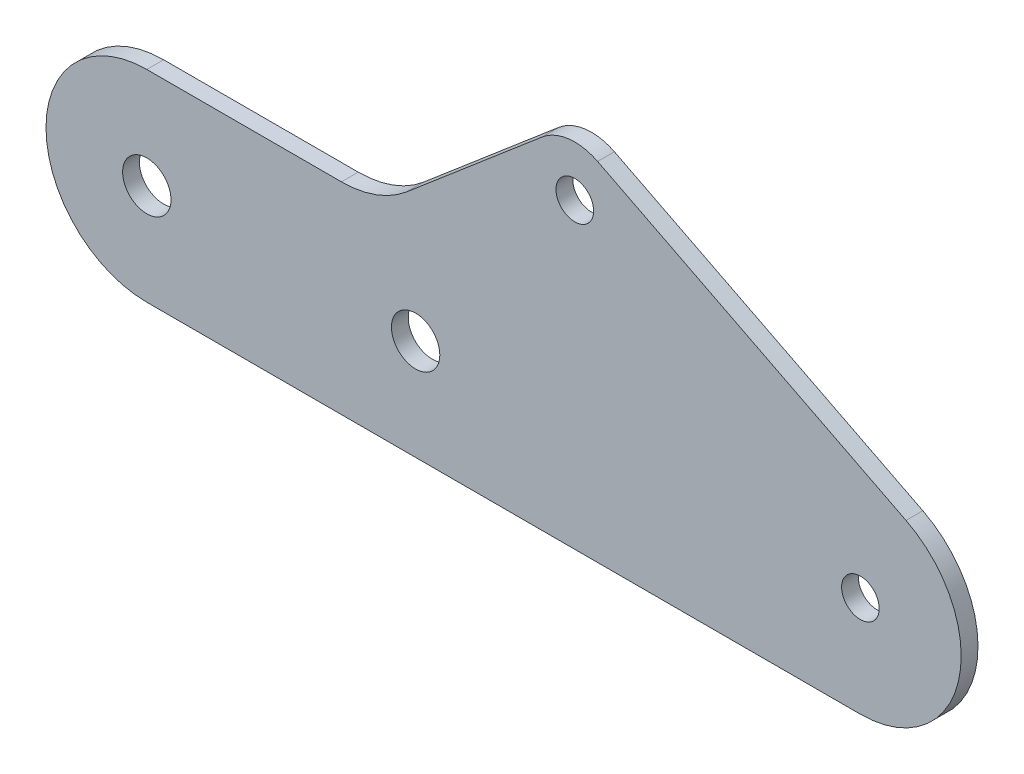
ISO-10303-21;
HEADER;
FILE_DESCRIPTION(('STEP AP214'),'2;1');
FILE_NAME('part.step','',(''),(''),'','','');
FILE_SCHEMA(('AUTOMOTIVE_DESIGN { 1 0 10303 214 1 1 1 1 }'));
ENDSEC;
DATA;
#1=APPLICATION_CONTEXT('core data for automotive mechanical design processes');
#2=APPLICATION_PROTOCOL_DEFINITION('international standard','automotive_design',2000,#1);
#3=PRODUCT_CONTEXT('',#1,'mechanical');
#4=PRODUCT('Part','Part','',(#3));
#5=PRODUCT_RELATED_PRODUCT_CATEGORY('part','',(#4));
#6=PRODUCT_DEFINITION_FORMATION('','',#4);
#7=PRODUCT_DEFINITION_CONTEXT('part definition',#1,'design');
#8=PRODUCT_DEFINITION('design','',#6,#7);
#9=PRODUCT_DEFINITION_SHAPE('','',#8);
#10=(LENGTH_UNIT() NAMED_UNIT(*) SI_UNIT(.MILLI.,.METRE.));
#11=(NAMED_UNIT(*) PLANE_ANGLE_UNIT() SI_UNIT($,.RADIAN.));
#12=(NAMED_UNIT(*) SI_UNIT($,.STERADIAN.) SOLID_ANGLE_UNIT());
#13=UNCERTAINTY_MEASURE_WITH_UNIT(LENGTH_MEASURE(1.E-05),#10,'distance_accuracy_value','');
#14=(GEOMETRIC_REPRESENTATION_CONTEXT(3) GLOBAL_UNCERTAINTY_ASSIGNED_CONTEXT((#13)) GLOBAL_UNIT_ASSIGNED_CONTEXT((#10,
#11,#12)) REPRESENTATION_CONTEXT('',''));
#15=CARTESIAN_POINT('',(0.,0.,0.));
#16=DIRECTION('',(0.,0.,1.));
#17=DIRECTION('',(1.,0.,0.));
#18=AXIS2_PLACEMENT_3D('',#15,#16,#17);
#19=CARTESIAN_POINT('',(-10.9366241433316,19.0499999999987,1.5875));
#20=DIRECTION('',(0.,0.,1.));
#21=DIRECTION('',(1.,0.,0.));
#22=AXIS2_PLACEMENT_3D('',#19,#20,#21);
#23=PLANE('',#22);
#24=CARTESIAN_POINT('',(11.1124999999989,19.0500000000027,1.5875));
#25=DIRECTION('',(0.,0.,1.));
#26=DIRECTION('',(1.,0.,0.));
#27=AXIS2_PLACEMENT_3D('',#24,#25,#26);
#28=CIRCLE('',#27,1.778);
#29=CARTESIAN_POINT('',(12.8904999999989,19.0500000000027,1.5875));
#30=VERTEX_POINT('',#29);
#31=EDGE_CURVE('E232',#30,#30,#28,.T.);
#32=ORIENTED_EDGE('',*,*,#31,.F.);
#33=EDGE_LOOP('',(#32));
#34=FACE_BOUND('',#33,.T.);
#35=CARTESIAN_POINT('',(-3.92950546862945,-6.47631827218178E-13,1.5875));
#36=DIRECTION('',(0.,0.,1.));
#37=DIRECTION('',(1.,0.,0.));
#38=AXIS2_PLACEMENT_3D('',#35,#36,#37);
#39=CIRCLE('',#38,2.28600000000077);
#40=CARTESIAN_POINT('',(-1.64350546862869,-6.47631827218178E-13,1.5875));
#41=VERTEX_POINT('',#40);
#42=EDGE_CURVE('E160',#41,#41,#39,.T.);
#43=ORIENTED_EDGE('',*,*,#42,.F.);
#44=EDGE_LOOP('',(#43));
#45=FACE_BOUND('',#44,.T.);
#46=CARTESIAN_POINT('',(-10.9366241433316,19.0499999999987,1.5875));
#47=DIRECTION('',(0.,0.,-1.));
#48=DIRECTION('',(1.,0.,0.));
#49=AXIS2_PLACEMENT_3D('',#46,#47,#48);
#50=CIRCLE('',#49,9.525);
#51=CARTESIAN_POINT('',(-4.76456775617586,11.7952536258123,1.5875));
#52=VERTEX_POINT('',#51);
#53=CARTESIAN_POINT('',(-10.9366241433316,9.52499999999867,1.5875));
#54=VERTEX_POINT('',#53);
#55=EDGE_CURVE('E178',#52,#54,#50,.T.);
#56=ORIENTED_EDGE('',*,*,#55,.T.);
#57=DIRECTION('',(-1.,0.,0.));
#58=VECTOR('',#57,1.);
#59=CARTESIAN_POINT('',(-29.3295054686295,9.52499999999935,1.5875));
#60=LINE('',#59,#58);
#61=CARTESIAN_POINT('',(-29.3295054686295,9.52499999999935,1.5875));
#62=VERTEX_POINT('',#61);
#63=EDGE_CURVE('E113',#54,#62,#60,.T.);
#64=ORIENTED_EDGE('',*,*,#63,.T.);
#65=CARTESIAN_POINT('',(-29.3295054686295,-6.52000980193578E-13,1.5875));
#66=DIRECTION('',(0.,0.,1.));
#67=DIRECTION('',(1.,0.,0.));
#68=AXIS2_PLACEMENT_3D('',#65,#66,#67);
#69=CIRCLE('',#68,9.52499999999935);
#70=CARTESIAN_POINT('',(-29.3295054686295,-9.525,1.5875));
#71=VERTEX_POINT('',#70);
#72=EDGE_CURVE('E197',#62,#71,#69,.T.);
#73=ORIENTED_EDGE('',*,*,#72,.T.);
#74=DIRECTION('',(1.,-1.05381036355604E-13,0.));
#75=VECTOR('',#74,1.);
#76=CARTESIAN_POINT('',(-29.3295054686295,-9.52499999999935,1.5875));
#77=LINE('',#76,#75);
#78=CARTESIAN_POINT('',(38.0999999999989,-9.52500000000135,1.5875));
#79=VERTEX_POINT('',#78);
#80=EDGE_CURVE('E210',#71,#79,#77,.T.);
#81=ORIENTED_EDGE('',*,*,#80,.T.);
#82=CARTESIAN_POINT('',(38.0999999999989,-1.34755926592855E-12,1.5875));
#83=DIRECTION('',(0.,0.,1.));
#84=DIRECTION('',(1.,0.,0.));
#85=AXIS2_PLACEMENT_3D('',#82,#83,#84);
#86=CIRCLE('',#85,9.52499999999956);
#87=CARTESIAN_POINT('',(42.4136398388671,8.49223977172677,1.5875));
#88=VERTEX_POINT('',#87);
#89=EDGE_CURVE('E135',#79,#88,#86,.T.);
#90=ORIENTED_EDGE('',*,*,#89,.T.);
#91=DIRECTION('',(-0.891573729315318,0.452875573634498,0.));
#92=VECTOR('',#91,1.);
#93=CARTESIAN_POINT('',(42.4136398388669,8.49223977172638,1.5875));
#94=LINE('',#93,#92);
#95=CARTESIAN_POINT('',(13.2693199194326,23.2961198858669,1.5875));
#96=VERTEX_POINT('',#95);
#97=EDGE_CURVE('E129',#88,#96,#94,.T.);
#98=ORIENTED_EDGE('',*,*,#97,.T.);
#99=CARTESIAN_POINT('',(11.1124999999989,19.0500000000027,1.5875));
#100=DIRECTION('',(0.,0.,1.));
#101=DIRECTION('',(1.,0.,0.));
#102=AXIS2_PLACEMENT_3D('',#99,#100,#101);
#103=CIRCLE('',#102,4.76250000000006);
#104=CARTESIAN_POINT('',(8.02647180642061,22.6773731870956,1.5875));
#105=VERTEX_POINT('',#104);
#106=EDGE_CURVE('E133',#96,#105,#103,.T.);
#107=ORIENTED_EDGE('',*,*,#106,.T.);
#108=DIRECTION('',(-0.761653162644236,-0.647984922536036,0.));
#109=VECTOR('',#108,1.);
#110=CARTESIAN_POINT('',(-4.76456775617586,11.7952536258123,1.5875));
#111=LINE('',#110,#109);
#112=EDGE_CURVE('E66',#105,#52,#111,.T.);
#113=ORIENTED_EDGE('',*,*,#112,.T.);
#114=EDGE_LOOP('',(#56,#64,#73,#81,#90,#98,#107,#113));
#115=FACE_BOUND('',#114,.T.);
#116=CARTESIAN_POINT('',(38.0999999999989,-1.34755926592855E-12,1.5875));
#117=DIRECTION('',(0.,0.,1.));
#118=DIRECTION('',(1.,0.,0.));
#119=AXIS2_PLACEMENT_3D('',#116,#117,#118);
#120=CIRCLE('',#119,1.778);
#121=CARTESIAN_POINT('',(39.8779999999989,-1.34755926592855E-12,1.5875));
#122=VERTEX_POINT('',#121);
#123=EDGE_CURVE('E225',#122,#122,#120,.T.);
#124=ORIENTED_EDGE('',*,*,#123,.F.);
#125=EDGE_LOOP('',(#124));
#126=FACE_BOUND('',#125,.T.);
#127=CARTESIAN_POINT('',(-29.3295054686295,-6.52000980193578E-13,1.5875));
#128=DIRECTION('',(0.,0.,1.));
#129=DIRECTION('',(1.,0.,0.));
#130=AXIS2_PLACEMENT_3D('',#127,#128,#129);
#131=CIRCLE('',#130,2.286);
#132=CARTESIAN_POINT('',(-27.0435054686295,-6.52000980193578E-13,1.5875));
#133=VERTEX_POINT('',#132);
#134=EDGE_CURVE('E240',#133,#133,#131,.T.);
#135=ORIENTED_EDGE('',*,*,#134,.F.);
#136=EDGE_LOOP('',(#135));
#137=FACE_BOUND('',#136,.T.);
#138=ADVANCED_FACE('F45',(#34,#45,#115,#126,#137),#23,.T.);
#139=CARTESIAN_POINT('',(-10.9366241433316,19.0499999999987,0.));
#140=DIRECTION('',(0.,0.,1.));
#141=DIRECTION('',(1.,0.,0.));
#142=AXIS2_PLACEMENT_3D('',#139,#140,#141);
#143=PLANE('',#142);
#144=CARTESIAN_POINT('',(-10.9366241433316,19.0499999999987,0.));
#145=DIRECTION('',(0.,0.,-1.));
#146=DIRECTION('',(1.,0.,0.));
#147=AXIS2_PLACEMENT_3D('',#144,#145,#146);
#148=CIRCLE('',#147,9.525);
#149=CARTESIAN_POINT('',(-4.76456775617586,11.7952536258123,0.));
#150=VERTEX_POINT('',#149);
#151=CARTESIAN_POINT('',(-10.9366241433316,9.52499999999867,0.));
#152=VERTEX_POINT('',#151);
#153=EDGE_CURVE('E155',#150,#152,#148,.T.);
#154=ORIENTED_EDGE('',*,*,#153,.F.);
#155=DIRECTION('',(-0.761653162644236,-0.647984922536036,0.));
#156=VECTOR('',#155,1.);
#157=CARTESIAN_POINT('',(-4.76456775617586,11.7952536258123,0.));
#158=LINE('',#157,#156);
#159=CARTESIAN_POINT('',(8.02647180642061,22.6773731870956,0.));
#160=VERTEX_POINT('',#159);
#161=EDGE_CURVE('E105',#160,#150,#158,.T.);
#162=ORIENTED_EDGE('',*,*,#161,.F.);
#163=CARTESIAN_POINT('',(11.1124999999989,19.0500000000027,0.));
#164=DIRECTION('',(0.,0.,1.));
#165=DIRECTION('',(1.,0.,0.));
#166=AXIS2_PLACEMENT_3D('',#163,#164,#165);
#167=CIRCLE('',#166,4.76250000000006);
#168=CARTESIAN_POINT('',(13.2693199194326,23.2961198858669,0.));
#169=VERTEX_POINT('',#168);
#170=EDGE_CURVE('E98',#169,#160,#167,.T.);
#171=ORIENTED_EDGE('',*,*,#170,.F.);
#172=DIRECTION('',(-0.891573729315318,0.452875573634498,0.));
#173=VECTOR('',#172,1.);
#174=CARTESIAN_POINT('',(42.4136398388669,8.49223977172638,0.));
#175=LINE('',#174,#173);
#176=CARTESIAN_POINT('',(42.4136398388671,8.49223977172677,0.));
#177=VERTEX_POINT('',#176);
#178=EDGE_CURVE('E144',#177,#169,#175,.T.);
#179=ORIENTED_EDGE('',*,*,#178,.F.);
#180=CARTESIAN_POINT('',(38.0999999999989,-1.34755926592855E-12,0.));
#181=DIRECTION('',(0.,0.,1.));
#182=DIRECTION('',(1.,0.,0.));
#183=AXIS2_PLACEMENT_3D('',#180,#181,#182);
#184=CIRCLE('',#183,9.52499999999956);
#185=CARTESIAN_POINT('',(38.0999999999989,-9.52500000000135,0.));
#186=VERTEX_POINT('',#185);
#187=EDGE_CURVE('E170',#186,#177,#184,.T.);
#188=ORIENTED_EDGE('',*,*,#187,.F.);
#189=DIRECTION('',(1.,0.,0.));
#190=VECTOR('',#189,1.);
#191=CARTESIAN_POINT('',(-3.92950546863065,-9.52500000000203,0.));
#192=LINE('',#191,#190);
#193=CARTESIAN_POINT('',(-29.3295054686295,-9.525,0.));
#194=VERTEX_POINT('',#193);
#195=EDGE_CURVE('E167',#194,#186,#192,.T.);
#196=ORIENTED_EDGE('',*,*,#195,.F.);
#197=CARTESIAN_POINT('',(-29.3295054686295,-6.52000980193578E-13,0.));
#198=DIRECTION('',(0.,0.,1.));
#199=DIRECTION('',(1.,0.,0.));
#200=AXIS2_PLACEMENT_3D('',#197,#198,#199);
#201=CIRCLE('',#200,9.52499999999935);
#202=CARTESIAN_POINT('',(-29.3295054686295,9.52499999999935,0.));
#203=VERTEX_POINT('',#202);
#204=EDGE_CURVE('E163',#203,#194,#201,.T.);
#205=ORIENTED_EDGE('',*,*,#204,.F.);
#206=DIRECTION('',(-1.,0.,0.));
#207=VECTOR('',#206,1.);
#208=CARTESIAN_POINT('',(-29.3295054686295,9.52499999999935,0.));
#209=LINE('',#208,#207);
#210=EDGE_CURVE('E159',#152,#203,#209,.T.);
#211=ORIENTED_EDGE('',*,*,#210,.F.);
#212=EDGE_LOOP('',(#154,#162,#171,#179,#188,#196,#205,#211));
#213=FACE_BOUND('',#212,.T.);
#214=CARTESIAN_POINT('',(-3.92950546862945,-6.47631827218178E-13,0.));
#215=DIRECTION('',(0.,0.,1.));
#216=DIRECTION('',(1.,0.,0.));
#217=AXIS2_PLACEMENT_3D('',#214,#215,#216);
#218=CIRCLE('',#217,2.28600000000077);
#219=CARTESIAN_POINT('',(-1.64350546862869,-6.47631827218178E-13,0.));
#220=VERTEX_POINT('',#219);
#221=EDGE_CURVE('E221',#220,#220,#218,.T.);
#222=ORIENTED_EDGE('',*,*,#221,.T.);
#223=EDGE_LOOP('',(#222));
#224=FACE_BOUND('',#223,.T.);
#225=CARTESIAN_POINT('',(38.0999999999989,-1.34755926592855E-12,0.));
#226=DIRECTION('',(0.,0.,1.));
#227=DIRECTION('',(1.,0.,0.));
#228=AXIS2_PLACEMENT_3D('',#225,#226,#227);
#229=CIRCLE('',#228,1.778);
#230=CARTESIAN_POINT('',(39.8779999999989,-1.34755926592855E-12,0.));
#231=VERTEX_POINT('',#230);
#232=EDGE_CURVE('E229',#231,#231,#229,.T.);
#233=ORIENTED_EDGE('',*,*,#232,.T.);
#234=EDGE_LOOP('',(#233));
#235=FACE_BOUND('',#234,.T.);
#236=CARTESIAN_POINT('',(11.1124999999989,19.0500000000027,0.));
#237=DIRECTION('',(0.,0.,1.));
#238=DIRECTION('',(1.,0.,0.));
#239=AXIS2_PLACEMENT_3D('',#236,#237,#238);
#240=CIRCLE('',#239,1.778);
#241=CARTESIAN_POINT('',(12.8904999999989,19.0500000000027,0.));
#242=VERTEX_POINT('',#241);
#243=EDGE_CURVE('E236',#242,#242,#240,.T.);
#244=ORIENTED_EDGE('',*,*,#243,.T.);
#245=EDGE_LOOP('',(#244));
#246=FACE_BOUND('',#245,.T.);
#247=CARTESIAN_POINT('',(-29.3295054686295,-6.52000980193578E-13,0.));
#248=DIRECTION('',(0.,0.,1.));
#249=DIRECTION('',(1.,0.,0.));
#250=AXIS2_PLACEMENT_3D('',#247,#248,#249);
#251=CIRCLE('',#250,2.286);
#252=CARTESIAN_POINT('',(-27.0435054686295,-6.52000980193578E-13,0.));
#253=VERTEX_POINT('',#252);
#254=EDGE_CURVE('E244',#253,#253,#251,.T.);
#255=ORIENTED_EDGE('',*,*,#254,.T.);
#256=EDGE_LOOP('',(#255));
#257=FACE_BOUND('',#256,.T.);
#258=ADVANCED_FACE('F200',(#213,#224,#235,#246,#257),#143,.F.);
#259=CARTESIAN_POINT('',(-10.9366241433316,19.0499999999987,1.5875));
#260=DIRECTION('',(0.,0.,-1.));
#261=DIRECTION('',(-1.,0.,0.));
#262=AXIS2_PLACEMENT_3D('',#259,#260,#261);
#263=CYLINDRICAL_SURFACE('',#262,9.525);
#264=ORIENTED_EDGE('',*,*,#153,.T.);
#265=DIRECTION('',(0.,0.,-1.));
#266=VECTOR('',#265,1.);
#267=CARTESIAN_POINT('',(-10.9366241433316,9.52499999999867,1.5875));
#268=LINE('',#267,#266);
#269=EDGE_CURVE('E11',#54,#152,#268,.T.);
#270=ORIENTED_EDGE('',*,*,#269,.F.);
#271=ORIENTED_EDGE('',*,*,#55,.F.);
#272=DIRECTION('',(0.,0.,-1.));
#273=VECTOR('',#272,1.);
#274=CARTESIAN_POINT('',(-4.76456775617586,11.7952536258123,1.5875));
#275=LINE('',#274,#273);
#276=EDGE_CURVE('E151',#52,#150,#275,.T.);
#277=ORIENTED_EDGE('',*,*,#276,.T.);
#278=EDGE_LOOP('',(#264,#270,#271,#277));
#279=FACE_BOUND('',#278,.T.);
#280=ADVANCED_FACE('F47',(#279),#263,.F.);
#281=CARTESIAN_POINT('',(-29.3295054686295,9.52499999999935,1.5875));
#282=DIRECTION('',(0.,-1.,0.));
#283=DIRECTION('',(1.,0.,0.));
#284=AXIS2_PLACEMENT_3D('',#281,#282,#283);
#285=PLANE('',#284);
#286=ORIENTED_EDGE('',*,*,#210,.T.);
#287=DIRECTION('',(0.,0.,-1.));
#288=VECTOR('',#287,1.);
#289=CARTESIAN_POINT('',(-29.3295054686295,9.52499999999935,1.5875));
#290=LINE('',#289,#288);
#291=EDGE_CURVE('E55',#62,#203,#290,.T.);
#292=ORIENTED_EDGE('',*,*,#291,.F.);
#293=ORIENTED_EDGE('',*,*,#63,.F.);
#294=ORIENTED_EDGE('',*,*,#269,.T.);
#295=EDGE_LOOP('',(#286,#292,#293,#294));
#296=FACE_BOUND('',#295,.T.);
#297=ADVANCED_FACE('F279',(#296),#285,.F.);
#298=CARTESIAN_POINT('',(-29.3295054686295,-6.52000980193578E-13,1.5875));
#299=DIRECTION('',(0.,0.,-1.));
#300=DIRECTION('',(-1.,0.,0.));
#301=AXIS2_PLACEMENT_3D('',#298,#299,#300);
#302=CYLINDRICAL_SURFACE('',#301,9.52499999999935);
#303=ORIENTED_EDGE('',*,*,#204,.T.);
#304=DIRECTION('',(0.,0.,-1.));
#305=VECTOR('',#304,1.);
#306=CARTESIAN_POINT('',(-29.3295054686295,-9.525,1.5875));
#307=LINE('',#306,#305);
#308=EDGE_CURVE('E187',#71,#194,#307,.T.);
#309=ORIENTED_EDGE('',*,*,#308,.F.);
#310=ORIENTED_EDGE('',*,*,#72,.F.);
#311=ORIENTED_EDGE('',*,*,#291,.T.);
#312=EDGE_LOOP('',(#303,#309,#310,#311));
#313=FACE_BOUND('',#312,.T.);
#314=ADVANCED_FACE('F195',(#313),#302,.T.);
#315=CARTESIAN_POINT('',(-3.92950546863065,-9.52500000000203,1.5875));
#316=DIRECTION('',(0.,1.,0.));
#317=DIRECTION('',(-1.,0.,0.));
#318=AXIS2_PLACEMENT_3D('',#315,#316,#317);
#319=PLANE('',#318);
#320=ORIENTED_EDGE('',*,*,#195,.T.);
#321=DIRECTION('',(0.,0.,-1.));
#322=VECTOR('',#321,1.);
#323=CARTESIAN_POINT('',(38.0999999999989,-9.52500000000135,1.5875));
#324=LINE('',#323,#322);
#325=EDGE_CURVE('E184',#79,#186,#324,.T.);
#326=ORIENTED_EDGE('',*,*,#325,.F.);
#327=ORIENTED_EDGE('',*,*,#80,.F.);
#328=ORIENTED_EDGE('',*,*,#308,.T.);
#329=EDGE_LOOP('',(#320,#326,#327,#328));
#330=FACE_BOUND('',#329,.T.);
#331=ADVANCED_FACE('F205',(#330),#319,.F.);
#332=CARTESIAN_POINT('',(38.0999999999989,-1.34755926592855E-12,1.5875));
#333=DIRECTION('',(0.,0.,-1.));
#334=DIRECTION('',(-1.,0.,0.));
#335=AXIS2_PLACEMENT_3D('',#332,#333,#334);
#336=CYLINDRICAL_SURFACE('',#335,9.52499999999956);
#337=ORIENTED_EDGE('',*,*,#187,.T.);
#338=DIRECTION('',(0.,0.,-1.));
#339=VECTOR('',#338,1.);
#340=CARTESIAN_POINT('',(42.4136398388671,8.49223977172677,1.5875));
#341=LINE('',#340,#339);
#342=EDGE_CURVE('E145',#88,#177,#341,.T.);
#343=ORIENTED_EDGE('',*,*,#342,.F.);
#344=ORIENTED_EDGE('',*,*,#89,.F.);
#345=ORIENTED_EDGE('',*,*,#325,.T.);
#346=EDGE_LOOP('',(#337,#343,#344,#345));
#347=FACE_BOUND('',#346,.T.);
#348=ADVANCED_FACE('F208',(#347),#336,.T.);
#349=CARTESIAN_POINT('',(42.4136398388669,8.49223977172638,1.5875));
#350=DIRECTION('',(-0.452875573634498,-0.891573729315318,0.));
#351=DIRECTION('',(0.891573729315318,-0.452875573634498,0.));
#352=AXIS2_PLACEMENT_3D('',#349,#350,#351);
#353=PLANE('',#352);
#354=ORIENTED_EDGE('',*,*,#178,.T.);
#355=DIRECTION('',(0.,0.,-1.));
#356=VECTOR('',#355,1.);
#357=CARTESIAN_POINT('',(13.2693199194326,23.2961198858669,1.5875));
#358=LINE('',#357,#356);
#359=EDGE_CURVE('E141',#96,#169,#358,.T.);
#360=ORIENTED_EDGE('',*,*,#359,.F.);
#361=ORIENTED_EDGE('',*,*,#97,.F.);
#362=ORIENTED_EDGE('',*,*,#342,.T.);
#363=EDGE_LOOP('',(#354,#360,#361,#362));
#364=FACE_BOUND('',#363,.T.);
#365=ADVANCED_FACE('F142',(#364),#353,.F.);
#366=CARTESIAN_POINT('',(11.1124999999989,19.0500000000027,1.5875));
#367=DIRECTION('',(0.,0.,-1.));
#368=DIRECTION('',(-1.,0.,0.));
#369=AXIS2_PLACEMENT_3D('',#366,#367,#368);
#370=CYLINDRICAL_SURFACE('',#369,4.76250000000006);
#371=ORIENTED_EDGE('',*,*,#170,.T.);
#372=DIRECTION('',(0.,0.,-1.));
#373=VECTOR('',#372,1.);
#374=CARTESIAN_POINT('',(8.02647180642061,22.6773731870956,1.5875));
#375=LINE('',#374,#373);
#376=EDGE_CURVE('E146',#105,#160,#375,.T.);
#377=ORIENTED_EDGE('',*,*,#376,.F.);
#378=ORIENTED_EDGE('',*,*,#106,.F.);
#379=ORIENTED_EDGE('',*,*,#359,.T.);
#380=EDGE_LOOP('',(#371,#377,#378,#379));
#381=FACE_BOUND('',#380,.T.);
#382=ADVANCED_FACE('F148',(#381),#370,.T.);
#383=CARTESIAN_POINT('',(-4.76456775617586,11.7952536258123,1.5875));
#384=DIRECTION('',(0.647984922536037,-0.761653162644236,0.));
#385=DIRECTION('',(0.761653162644236,0.647984922536037,0.));
#386=AXIS2_PLACEMENT_3D('',#383,#384,#385);
#387=PLANE('',#386);
#388=ORIENTED_EDGE('',*,*,#161,.T.);
#389=ORIENTED_EDGE('',*,*,#276,.F.);
#390=ORIENTED_EDGE('',*,*,#112,.F.);
#391=ORIENTED_EDGE('',*,*,#376,.T.);
#392=EDGE_LOOP('',(#388,#389,#390,#391));
#393=FACE_BOUND('',#392,.T.);
#394=ADVANCED_FACE('F267',(#393),#387,.F.);
#395=CARTESIAN_POINT('',(-3.92950546862945,-6.47631827218178E-13,1.5875));
#396=DIRECTION('',(0.,0.,-1.));
#397=DIRECTION('',(-1.,0.,0.));
#398=AXIS2_PLACEMENT_3D('',#395,#396,#397);
#399=CYLINDRICAL_SURFACE('',#398,2.28600000000077);
#400=ORIENTED_EDGE('',*,*,#42,.T.);
#401=EDGE_LOOP('',(#400));
#402=FACE_BOUND('',#401,.T.);
#403=ORIENTED_EDGE('',*,*,#221,.F.);
#404=EDGE_LOOP('',(#403));
#405=FACE_BOUND('',#404,.T.);
#406=ADVANCED_FACE('F264',(#402,#405),#399,.F.);
#407=CARTESIAN_POINT('',(38.0999999999989,-1.34755926592855E-12,1.5875));
#408=DIRECTION('',(0.,0.,-1.));
#409=DIRECTION('',(-1.,0.,0.));
#410=AXIS2_PLACEMENT_3D('',#407,#408,#409);
#411=CYLINDRICAL_SURFACE('',#410,1.778);
#412=ORIENTED_EDGE('',*,*,#123,.T.);
#413=EDGE_LOOP('',(#412));
#414=FACE_BOUND('',#413,.T.);
#415=ORIENTED_EDGE('',*,*,#232,.F.);
#416=EDGE_LOOP('',(#415));
#417=FACE_BOUND('',#416,.T.);
#418=ADVANCED_FACE('F338',(#414,#417),#411,.F.);
#419=CARTESIAN_POINT('',(11.1124999999989,19.0500000000027,1.5875));
#420=DIRECTION('',(0.,0.,-1.));
#421=DIRECTION('',(-1.,0.,0.));
#422=AXIS2_PLACEMENT_3D('',#419,#420,#421);
#423=CYLINDRICAL_SURFACE('',#422,1.778);
#424=ORIENTED_EDGE('',*,*,#31,.T.);
#425=EDGE_LOOP('',(#424));
#426=FACE_BOUND('',#425,.T.);
#427=ORIENTED_EDGE('',*,*,#243,.F.);
#428=EDGE_LOOP('',(#427));
#429=FACE_BOUND('',#428,.T.);
#430=ADVANCED_FACE('F346',(#426,#429),#423,.F.);
#431=CARTESIAN_POINT('',(-29.3295054686295,-6.52000980193578E-13,1.5875));
#432=DIRECTION('',(0.,0.,-1.));
#433=DIRECTION('',(-1.,0.,0.));
#434=AXIS2_PLACEMENT_3D('',#431,#432,#433);
#435=CYLINDRICAL_SURFACE('',#434,2.286);
#436=ORIENTED_EDGE('',*,*,#134,.T.);
#437=EDGE_LOOP('',(#436));
#438=FACE_BOUND('',#437,.T.);
#439=ORIENTED_EDGE('',*,*,#254,.F.);
#440=EDGE_LOOP('',(#439));
#441=FACE_BOUND('',#440,.T.);
#442=ADVANCED_FACE('F252',(#438,#441),#435,.F.);
#443=CLOSED_SHELL('',(#138,#258,#280,#297,#314,#331,#348,#365,#382,#394,#406,#418,#430,#442));
#444=MANIFOLD_SOLID_BREP('B2',#443);
#445=ADVANCED_BREP_SHAPE_REPRESENTATION('',(#18,#444),#14);
#446=SHAPE_DEFINITION_REPRESENTATION(#9,#445);
ENDSEC;
END-ISO-10303-21;
